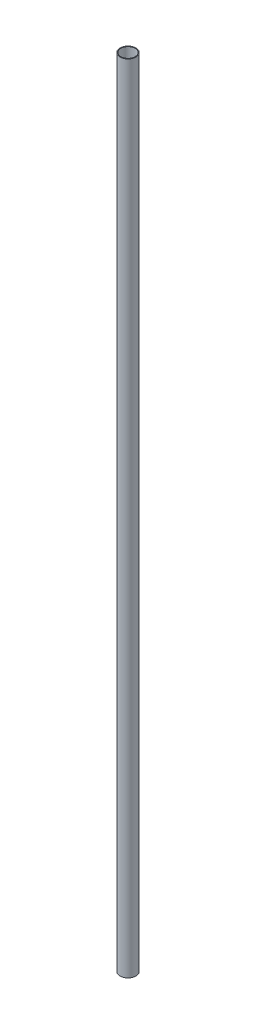
ISO-10303-21;
HEADER;
FILE_DESCRIPTION(('STEP AP214'),'2;1');
FILE_NAME('part.step','',(''),(''),'','','');
FILE_SCHEMA(('AUTOMOTIVE_DESIGN { 1 0 10303 214 1 1 1 1 }'));
ENDSEC;
DATA;
#1=APPLICATION_CONTEXT('core data for automotive mechanical design processes');
#2=APPLICATION_PROTOCOL_DEFINITION('international standard','automotive_design',2000,#1);
#3=PRODUCT_CONTEXT('',#1,'mechanical');
#4=PRODUCT('Part','Part','',(#3));
#5=PRODUCT_RELATED_PRODUCT_CATEGORY('part','',(#4));
#6=PRODUCT_DEFINITION_FORMATION('','',#4);
#7=PRODUCT_DEFINITION_CONTEXT('part definition',#1,'design');
#8=PRODUCT_DEFINITION('design','',#6,#7);
#9=PRODUCT_DEFINITION_SHAPE('','',#8);
#10=(LENGTH_UNIT() NAMED_UNIT(*) SI_UNIT(.MILLI.,.METRE.));
#11=(NAMED_UNIT(*) PLANE_ANGLE_UNIT() SI_UNIT($,.RADIAN.));
#12=(NAMED_UNIT(*) SI_UNIT($,.STERADIAN.) SOLID_ANGLE_UNIT());
#13=UNCERTAINTY_MEASURE_WITH_UNIT(LENGTH_MEASURE(1.E-05),#10,'distance_accuracy_value','');
#14=(GEOMETRIC_REPRESENTATION_CONTEXT(3) GLOBAL_UNCERTAINTY_ASSIGNED_CONTEXT((#13)) GLOBAL_UNIT_ASSIGNED_CONTEXT((#10,
#11,#12)) REPRESENTATION_CONTEXT('',''));
#15=CARTESIAN_POINT('',(0.,0.,0.));
#16=DIRECTION('',(0.,0.,1.));
#17=DIRECTION('',(1.,0.,0.));
#18=AXIS2_PLACEMENT_3D('',#15,#16,#17);
#19=CARTESIAN_POINT('',(0.,1000.,0.));
#20=DIRECTION('',(0.,1.,0.));
#21=DIRECTION('',(0.,0.,1.));
#22=AXIS2_PLACEMENT_3D('',#19,#20,#21);
#23=PLANE('',#22);
#24=CARTESIAN_POINT('',(0.,1000.,0.));
#25=DIRECTION('',(0.,1.,0.));
#26=DIRECTION('',(0.,0.,1.));
#27=AXIS2_PLACEMENT_3D('',#24,#25,#26);
#28=CIRCLE('',#27,10.);
#29=CARTESIAN_POINT('',(0.,1000.,10.));
#30=VERTEX_POINT('',#29);
#31=EDGE_CURVE('E10',#30,#30,#28,.T.);
#32=ORIENTED_EDGE('',*,*,#31,.T.);
#33=EDGE_LOOP('',(#32));
#34=FACE_BOUND('',#33,.T.);
#35=CARTESIAN_POINT('',(0.,1000.,0.));
#36=DIRECTION('',(0.,1.,0.));
#37=DIRECTION('',(0.,0.,1.));
#38=AXIS2_PLACEMENT_3D('',#35,#36,#37);
#39=CIRCLE('',#38,9.);
#40=CARTESIAN_POINT('',(0.,1000.,9.));
#41=VERTEX_POINT('',#40);
#42=EDGE_CURVE('E46',#41,#41,#39,.T.);
#43=ORIENTED_EDGE('',*,*,#42,.F.);
#44=EDGE_LOOP('',(#43));
#45=FACE_BOUND('',#44,.T.);
#46=ADVANCED_FACE('F35',(#34,#45),#23,.T.);
#47=CARTESIAN_POINT('',(0.,0.,0.));
#48=DIRECTION('',(0.,1.,0.));
#49=DIRECTION('',(0.,0.,1.));
#50=AXIS2_PLACEMENT_3D('',#47,#48,#49);
#51=PLANE('',#50);
#52=CARTESIAN_POINT('',(0.,0.,0.));
#53=DIRECTION('',(0.,1.,0.));
#54=DIRECTION('',(0.,0.,1.));
#55=AXIS2_PLACEMENT_3D('',#52,#53,#54);
#56=CIRCLE('',#55,10.);
#57=CARTESIAN_POINT('',(0.,0.,10.));
#58=VERTEX_POINT('',#57);
#59=EDGE_CURVE('E39',#58,#58,#56,.T.);
#60=ORIENTED_EDGE('',*,*,#59,.F.);
#61=EDGE_LOOP('',(#60));
#62=FACE_BOUND('',#61,.T.);
#63=CARTESIAN_POINT('',(0.,0.,0.));
#64=DIRECTION('',(0.,1.,0.));
#65=DIRECTION('',(0.,0.,1.));
#66=AXIS2_PLACEMENT_3D('',#63,#64,#65);
#67=CIRCLE('',#66,9.);
#68=CARTESIAN_POINT('',(0.,0.,9.));
#69=VERTEX_POINT('',#68);
#70=EDGE_CURVE('E48',#69,#69,#67,.T.);
#71=ORIENTED_EDGE('',*,*,#70,.T.);
#72=EDGE_LOOP('',(#71));
#73=FACE_BOUND('',#72,.T.);
#74=ADVANCED_FACE('F58',(#62,#73),#51,.F.);
#75=CARTESIAN_POINT('',(0.,1000.,0.));
#76=DIRECTION('',(0.,-1.,0.));
#77=DIRECTION('',(0.,0.,-1.));
#78=AXIS2_PLACEMENT_3D('',#75,#76,#77);
#79=CYLINDRICAL_SURFACE('',#78,10.);
#80=ORIENTED_EDGE('',*,*,#31,.F.);
#81=EDGE_LOOP('',(#80));
#82=FACE_BOUND('',#81,.T.);
#83=ORIENTED_EDGE('',*,*,#59,.T.);
#84=EDGE_LOOP('',(#83));
#85=FACE_BOUND('',#84,.T.);
#86=ADVANCED_FACE('F37',(#82,#85),#79,.T.);
#87=CARTESIAN_POINT('',(0.,1000.,0.));
#88=DIRECTION('',(0.,-1.,0.));
#89=DIRECTION('',(0.,0.,-1.));
#90=AXIS2_PLACEMENT_3D('',#87,#88,#89);
#91=CYLINDRICAL_SURFACE('',#90,9.);
#92=ORIENTED_EDGE('',*,*,#42,.T.);
#93=EDGE_LOOP('',(#92));
#94=FACE_BOUND('',#93,.T.);
#95=ORIENTED_EDGE('',*,*,#70,.F.);
#96=EDGE_LOOP('',(#95));
#97=FACE_BOUND('',#96,.T.);
#98=ADVANCED_FACE('F54',(#94,#97),#91,.F.);
#99=CLOSED_SHELL('',(#46,#74,#86,#98));
#100=MANIFOLD_SOLID_BREP('B2',#99);
#101=ADVANCED_BREP_SHAPE_REPRESENTATION('',(#18,#100),#14);
#102=SHAPE_DEFINITION_REPRESENTATION(#9,#101);
ENDSEC;
END-ISO-10303-21;
